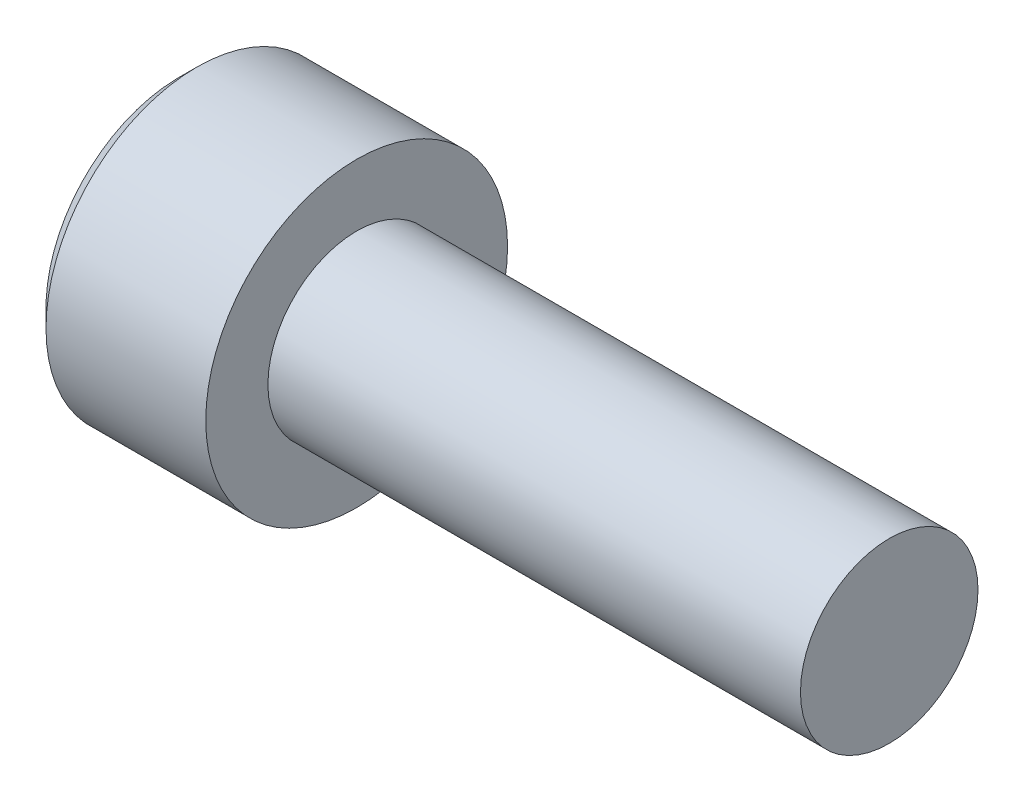
ISO-10303-21;
HEADER;
FILE_DESCRIPTION(('STEP AP214'),'2;1');
FILE_NAME('part.step','',(''),(''),'','','');
FILE_SCHEMA(('AUTOMOTIVE_DESIGN { 1 0 10303 214 1 1 1 1 }'));
ENDSEC;
DATA;
#1=APPLICATION_CONTEXT('core data for automotive mechanical design processes');
#2=APPLICATION_PROTOCOL_DEFINITION('international standard','automotive_design',2000,#1);
#3=PRODUCT_CONTEXT('',#1,'mechanical');
#4=PRODUCT('Part','Part','',(#3));
#5=PRODUCT_RELATED_PRODUCT_CATEGORY('part','',(#4));
#6=PRODUCT_DEFINITION_FORMATION('','',#4);
#7=PRODUCT_DEFINITION_CONTEXT('part definition',#1,'design');
#8=PRODUCT_DEFINITION('design','',#6,#7);
#9=PRODUCT_DEFINITION_SHAPE('','',#8);
#10=(LENGTH_UNIT() NAMED_UNIT(*) SI_UNIT(.MILLI.,.METRE.));
#11=(NAMED_UNIT(*) PLANE_ANGLE_UNIT() SI_UNIT($,.RADIAN.));
#12=(NAMED_UNIT(*) SI_UNIT($,.STERADIAN.) SOLID_ANGLE_UNIT());
#13=UNCERTAINTY_MEASURE_WITH_UNIT(LENGTH_MEASURE(1.E-05),#10,'distance_accuracy_value','');
#14=(GEOMETRIC_REPRESENTATION_CONTEXT(3) GLOBAL_UNCERTAINTY_ASSIGNED_CONTEXT((#13)) GLOBAL_UNIT_ASSIGNED_CONTEXT((#10,
#11,#12)) REPRESENTATION_CONTEXT('',''));
#15=CARTESIAN_POINT('',(0.,0.,0.));
#16=DIRECTION('',(0.,0.,1.));
#17=DIRECTION('',(1.,0.,0.));
#18=AXIS2_PLACEMENT_3D('',#15,#16,#17);
#19=CARTESIAN_POINT('',(-2.5,0.,0.));
#20=DIRECTION('',(-1.,0.,0.));
#21=DIRECTION('',(0.,0.,1.));
#22=AXIS2_PLACEMENT_3D('',#19,#20,#21);
#23=PLANE('',#22);
#24=CARTESIAN_POINT('',(-2.49999999999982,0.,0.));
#25=DIRECTION('',(-1.,0.,0.));
#26=DIRECTION('',(0.,-1.,0.));
#27=AXIS2_PLACEMENT_3D('',#24,#25,#26);
#28=CIRCLE('',#27,2.);
#29=CARTESIAN_POINT('',(-2.49999999999991,1.73205080756888,1.));
#30=VERTEX_POINT('',#29);
#31=CARTESIAN_POINT('',(-2.49999999999991,0.,2.));
#32=VERTEX_POINT('',#31);
#33=EDGE_CURVE('E20',#30,#32,#28,.F.);
#34=ORIENTED_EDGE('',*,*,#33,.T.);
#35=DIRECTION('',(0.,1.,0.));
#36=VECTOR('',#35,1.);
#37=CARTESIAN_POINT('',(-2.5,0.,2.));
#38=LINE('',#37,#36);
#39=CARTESIAN_POINT('',(-2.5,1.15470053837925,2.));
#40=VERTEX_POINT('',#39);
#41=EDGE_CURVE('E85',#32,#40,#38,.T.);
#42=ORIENTED_EDGE('',*,*,#41,.T.);
#43=DIRECTION('',(0.,0.5,-0.866025403784439));
#44=VECTOR('',#43,1.);
#45=CARTESIAN_POINT('',(-2.5,1.15470053837925,2.));
#46=LINE('',#45,#44);
#47=EDGE_CURVE('E105',#40,#30,#46,.T.);
#48=ORIENTED_EDGE('',*,*,#47,.T.);
#49=EDGE_LOOP('',(#34,#42,#48));
#50=FACE_BOUND('',#49,.T.);
#51=ADVANCED_FACE('F17',(#50),#23,.T.);
#52=CARTESIAN_POINT('',(-2.5,0.,0.));
#53=DIRECTION('',(-1.,0.,0.));
#54=DIRECTION('',(0.,0.,1.));
#55=AXIS2_PLACEMENT_3D('',#52,#53,#54);
#56=PLANE('',#55);
#57=CARTESIAN_POINT('',(-2.49999999999982,0.,0.));
#58=DIRECTION('',(-1.,0.,0.));
#59=DIRECTION('',(0.,-1.,0.));
#60=AXIS2_PLACEMENT_3D('',#57,#58,#59);
#61=CIRCLE('',#60,2.);
#62=CARTESIAN_POINT('',(-2.49999999999991,-1.73205080756888,1.));
#63=VERTEX_POINT('',#62);
#64=EDGE_CURVE('E115',#32,#63,#61,.F.);
#65=ORIENTED_EDGE('',*,*,#64,.T.);
#66=DIRECTION('',(0.,0.499999999999999,0.866025403784439));
#67=VECTOR('',#66,1.);
#68=CARTESIAN_POINT('',(-2.5,-1.73205080756888,1.));
#69=LINE('',#68,#67);
#70=CARTESIAN_POINT('',(-2.5,-1.15470053837925,2.));
#71=VERTEX_POINT('',#70);
#72=EDGE_CURVE('E123',#63,#71,#69,.T.);
#73=ORIENTED_EDGE('',*,*,#72,.T.);
#74=DIRECTION('',(0.,1.,0.));
#75=VECTOR('',#74,1.);
#76=CARTESIAN_POINT('',(-2.5,0.,2.));
#77=LINE('',#76,#75);
#78=EDGE_CURVE('E135',#71,#32,#77,.T.);
#79=ORIENTED_EDGE('',*,*,#78,.T.);
#80=EDGE_LOOP('',(#65,#73,#79));
#81=FACE_BOUND('',#80,.T.);
#82=ADVANCED_FACE('F411',(#81),#56,.T.);
#83=CARTESIAN_POINT('',(-2.5,0.,0.));
#84=DIRECTION('',(-1.,0.,0.));
#85=DIRECTION('',(0.,0.,1.));
#86=AXIS2_PLACEMENT_3D('',#83,#84,#85);
#87=PLANE('',#86);
#88=CARTESIAN_POINT('',(-2.49999999999982,0.,0.));
#89=DIRECTION('',(-1.,0.,0.));
#90=DIRECTION('',(0.,-1.,0.));
#91=AXIS2_PLACEMENT_3D('',#88,#89,#90);
#92=CIRCLE('',#91,2.);
#93=CARTESIAN_POINT('',(-2.49999999999991,0.,-2.));
#94=VERTEX_POINT('',#93);
#95=CARTESIAN_POINT('',(-2.49999999999991,1.73205080756888,-1.));
#96=VERTEX_POINT('',#95);
#97=EDGE_CURVE('E101',#94,#96,#92,.F.);
#98=ORIENTED_EDGE('',*,*,#97,.T.);
#99=DIRECTION('',(0.,-0.5,-0.866025403784439));
#100=VECTOR('',#99,1.);
#101=CARTESIAN_POINT('',(-2.5,1.73205080756888,-1.));
#102=LINE('',#101,#100);
#103=CARTESIAN_POINT('',(-2.5,1.15470053837925,-2.));
#104=VERTEX_POINT('',#103);
#105=EDGE_CURVE('E116',#96,#104,#102,.T.);
#106=ORIENTED_EDGE('',*,*,#105,.T.);
#107=DIRECTION('',(0.,1.,0.));
#108=VECTOR('',#107,1.);
#109=CARTESIAN_POINT('',(-2.5,0.,-2.));
#110=LINE('',#109,#108);
#111=EDGE_CURVE('E119',#104,#94,#110,.F.);
#112=ORIENTED_EDGE('',*,*,#111,.T.);
#113=EDGE_LOOP('',(#98,#106,#112));
#114=FACE_BOUND('',#113,.T.);
#115=ADVANCED_FACE('F402',(#114),#87,.T.);
#116=CARTESIAN_POINT('',(-2.49999999999995,0.,0.));
#117=DIRECTION('',(-1.,0.,0.));
#118=DIRECTION('',(0.,-1.,0.));
#119=AXIS2_PLACEMENT_3D('',#116,#117,#118);
#120=CONICAL_SURFACE('',#119,2.00000000000022,1.04719755119663);
#121=CARTESIAN_POINT('',(-1.3452994616206,2.22044604925031E-13,0.));
#122=VERTEX_POINT('',#121);
#123=VERTEX_LOOP('',#122);
#124=FACE_BOUND('',#123,.T.);
#125=ORIENTED_EDGE('',*,*,#33,.F.);
#126=CARTESIAN_POINT('',(-2.49999999999982,0.,0.));
#127=DIRECTION('',(-1.,0.,0.));
#128=DIRECTION('',(0.,-1.,0.));
#129=AXIS2_PLACEMENT_3D('',#126,#127,#128);
#130=CIRCLE('',#129,2.);
#131=EDGE_CURVE('E91',#96,#30,#130,.F.);
#132=ORIENTED_EDGE('',*,*,#131,.F.);
#133=ORIENTED_EDGE('',*,*,#97,.F.);
#134=CARTESIAN_POINT('',(-2.49999999999982,0.,0.));
#135=DIRECTION('',(-1.,0.,0.));
#136=DIRECTION('',(0.,-1.,0.));
#137=AXIS2_PLACEMENT_3D('',#134,#135,#136);
#138=CIRCLE('',#137,2.);
#139=CARTESIAN_POINT('',(-2.49999999999991,-1.73205080756888,-0.999999999999999));
#140=VERTEX_POINT('',#139);
#141=EDGE_CURVE('E171',#140,#94,#138,.F.);
#142=ORIENTED_EDGE('',*,*,#141,.F.);
#143=CARTESIAN_POINT('',(-2.49999999999982,0.,0.));
#144=DIRECTION('',(-1.,0.,0.));
#145=DIRECTION('',(0.,-1.,0.));
#146=AXIS2_PLACEMENT_3D('',#143,#144,#145);
#147=CIRCLE('',#146,2.);
#148=EDGE_CURVE('E117',#63,#140,#147,.F.);
#149=ORIENTED_EDGE('',*,*,#148,.F.);
#150=ORIENTED_EDGE('',*,*,#64,.F.);
#151=EDGE_LOOP('',(#125,#132,#133,#142,#149,#150));
#152=FACE_BOUND('',#151,.T.);
#153=ADVANCED_FACE('F113',(#124,#152),#120,.F.);
#154=CARTESIAN_POINT('',(-2.5,0.,0.));
#155=DIRECTION('',(-1.,0.,0.));
#156=DIRECTION('',(0.,0.,1.));
#157=AXIS2_PLACEMENT_3D('',#154,#155,#156);
#158=PLANE('',#157);
#159=ORIENTED_EDGE('',*,*,#141,.T.);
#160=DIRECTION('',(0.,1.,0.));
#161=VECTOR('',#160,1.);
#162=CARTESIAN_POINT('',(-2.5,1.15470053837925,-2.));
#163=LINE('',#162,#161);
#164=CARTESIAN_POINT('',(-2.5,-1.15470053837925,-2.));
#165=VERTEX_POINT('',#164);
#166=EDGE_CURVE('E173',#94,#165,#163,.F.);
#167=ORIENTED_EDGE('',*,*,#166,.T.);
#168=DIRECTION('',(0.,-0.499999999999999,0.866025403784439));
#169=VECTOR('',#168,1.);
#170=CARTESIAN_POINT('',(-2.5,-1.15470053837925,-2.));
#171=LINE('',#170,#169);
#172=EDGE_CURVE('E100',#165,#140,#171,.T.);
#173=ORIENTED_EDGE('',*,*,#172,.T.);
#174=EDGE_LOOP('',(#159,#167,#173));
#175=FACE_BOUND('',#174,.T.);
#176=ADVANCED_FACE('F196',(#175),#158,.T.);
#177=CARTESIAN_POINT('',(-2.5,0.,0.));
#178=DIRECTION('',(-1.,0.,0.));
#179=DIRECTION('',(0.,0.,1.));
#180=AXIS2_PLACEMENT_3D('',#177,#178,#179);
#181=PLANE('',#180);
#182=ORIENTED_EDGE('',*,*,#148,.T.);
#183=DIRECTION('',(0.,0.5,-0.866025403784439));
#184=VECTOR('',#183,1.);
#185=CARTESIAN_POINT('',(-2.5,-1.15470053837925,-2.));
#186=LINE('',#185,#184);
#187=CARTESIAN_POINT('',(-2.5,-2.3094010767585,0.));
#188=VERTEX_POINT('',#187);
#189=EDGE_CURVE('E180',#140,#188,#186,.F.);
#190=ORIENTED_EDGE('',*,*,#189,.T.);
#191=DIRECTION('',(0.,-0.5,-0.866025403784439));
#192=VECTOR('',#191,1.);
#193=CARTESIAN_POINT('',(-2.5,-2.3094010767585,0.));
#194=LINE('',#193,#192);
#195=EDGE_CURVE('E155',#188,#63,#194,.F.);
#196=ORIENTED_EDGE('',*,*,#195,.T.);
#197=EDGE_LOOP('',(#182,#190,#196));
#198=FACE_BOUND('',#197,.T.);
#199=ADVANCED_FACE('F179',(#198),#181,.T.);
#200=CARTESIAN_POINT('',(-2.5,0.,0.));
#201=DIRECTION('',(-1.,0.,0.));
#202=DIRECTION('',(0.,0.,1.));
#203=AXIS2_PLACEMENT_3D('',#200,#201,#202);
#204=PLANE('',#203);
#205=ORIENTED_EDGE('',*,*,#131,.T.);
#206=DIRECTION('',(0.,-0.5,0.866025403784439));
#207=VECTOR('',#206,1.);
#208=CARTESIAN_POINT('',(-2.5,1.15470053837925,2.));
#209=LINE('',#208,#207);
#210=CARTESIAN_POINT('',(-2.5,2.3094010767585,0.));
#211=VERTEX_POINT('',#210);
#212=EDGE_CURVE('E94',#30,#211,#209,.F.);
#213=ORIENTED_EDGE('',*,*,#212,.T.);
#214=DIRECTION('',(0.,0.5,0.866025403784439));
#215=VECTOR('',#214,1.);
#216=CARTESIAN_POINT('',(-2.5,2.3094010767585,0.));
#217=LINE('',#216,#215);
#218=EDGE_CURVE('E96',#211,#96,#217,.F.);
#219=ORIENTED_EDGE('',*,*,#218,.T.);
#220=EDGE_LOOP('',(#205,#213,#219));
#221=FACE_BOUND('',#220,.T.);
#222=ADVANCED_FACE('F93',(#221),#204,.T.);
#223=CARTESIAN_POINT('',(-2.5,1.15470053837925,-2.));
#224=DIRECTION('',(0.,0.,-1.));
#225=DIRECTION('',(0.,1.,0.));
#226=AXIS2_PLACEMENT_3D('',#223,#224,#225);
#227=PLANE('',#226);
#228=DIRECTION('',(1.,0.,0.));
#229=VECTOR('',#228,1.);
#230=CARTESIAN_POINT('',(-2.5,-1.15470053837925,-2.));
#231=LINE('',#230,#229);
#232=CARTESIAN_POINT('',(-5.,-1.15470053837925,-2.));
#233=VERTEX_POINT('',#232);
#234=EDGE_CURVE('E192',#233,#165,#231,.T.);
#235=ORIENTED_EDGE('',*,*,#234,.T.);
#236=ORIENTED_EDGE('',*,*,#166,.F.);
#237=ORIENTED_EDGE('',*,*,#111,.F.);
#238=DIRECTION('',(1.,0.,0.));
#239=VECTOR('',#238,1.);
#240=CARTESIAN_POINT('',(-2.5,1.15470053837925,-2.));
#241=LINE('',#240,#239);
#242=CARTESIAN_POINT('',(-5.,1.15470053837925,-2.));
#243=VERTEX_POINT('',#242);
#244=EDGE_CURVE('E146',#104,#243,#241,.F.);
#245=ORIENTED_EDGE('',*,*,#244,.T.);
#246=DIRECTION('',(0.,1.,0.));
#247=VECTOR('',#246,1.);
#248=CARTESIAN_POINT('',(-5.,0.,-2.));
#249=LINE('',#248,#247);
#250=EDGE_CURVE('E149',#243,#233,#249,.F.);
#251=ORIENTED_EDGE('',*,*,#250,.T.);
#252=EDGE_LOOP('',(#235,#236,#237,#245,#251));
#253=FACE_BOUND('',#252,.T.);
#254=ADVANCED_FACE('F209',(#253),#227,.F.);
#255=CARTESIAN_POINT('',(-2.5,-1.15470053837925,-2.));
#256=DIRECTION('',(0.,-0.866025403784439,-0.5));
#257=DIRECTION('',(0.,0.5,-0.866025403784439));
#258=AXIS2_PLACEMENT_3D('',#255,#256,#257);
#259=PLANE('',#258);
#260=DIRECTION('',(1.,0.,0.));
#261=VECTOR('',#260,1.);
#262=CARTESIAN_POINT('',(-2.5,-2.3094010767585,0.));
#263=LINE('',#262,#261);
#264=CARTESIAN_POINT('',(-5.,-2.3094010767585,0.));
#265=VERTEX_POINT('',#264);
#266=EDGE_CURVE('E191',#265,#188,#263,.T.);
#267=ORIENTED_EDGE('',*,*,#266,.T.);
#268=ORIENTED_EDGE('',*,*,#189,.F.);
#269=ORIENTED_EDGE('',*,*,#172,.F.);
#270=ORIENTED_EDGE('',*,*,#234,.F.);
#271=DIRECTION('',(0.,-0.5,0.866025403784439));
#272=VECTOR('',#271,1.);
#273=CARTESIAN_POINT('',(-5.,-1.15470053837925,-2.));
#274=LINE('',#273,#272);
#275=EDGE_CURVE('E212',#233,#265,#274,.T.);
#276=ORIENTED_EDGE('',*,*,#275,.T.);
#277=EDGE_LOOP('',(#267,#268,#269,#270,#276));
#278=FACE_BOUND('',#277,.T.);
#279=ADVANCED_FACE('F186',(#278),#259,.F.);
#280=CARTESIAN_POINT('',(-2.5,-2.3094010767585,0.));
#281=DIRECTION('',(0.,-0.866025403784439,0.5));
#282=DIRECTION('',(0.,-0.5,-0.866025403784439));
#283=AXIS2_PLACEMENT_3D('',#280,#281,#282);
#284=PLANE('',#283);
#285=DIRECTION('',(1.,0.,0.));
#286=VECTOR('',#285,1.);
#287=CARTESIAN_POINT('',(-2.5,-1.15470053837925,2.));
#288=LINE('',#287,#286);
#289=CARTESIAN_POINT('',(-5.,-1.15470053837925,2.));
#290=VERTEX_POINT('',#289);
#291=EDGE_CURVE('E152',#290,#71,#288,.T.);
#292=ORIENTED_EDGE('',*,*,#291,.T.);
#293=ORIENTED_EDGE('',*,*,#72,.F.);
#294=ORIENTED_EDGE('',*,*,#195,.F.);
#295=ORIENTED_EDGE('',*,*,#266,.F.);
#296=DIRECTION('',(0.,0.5,0.866025403784438));
#297=VECTOR('',#296,1.);
#298=CARTESIAN_POINT('',(-5.,-2.3094010767585,0.));
#299=LINE('',#298,#297);
#300=EDGE_CURVE('E220',#265,#290,#299,.T.);
#301=ORIENTED_EDGE('',*,*,#300,.T.);
#302=EDGE_LOOP('',(#292,#293,#294,#295,#301));
#303=FACE_BOUND('',#302,.T.);
#304=ADVANCED_FACE('F351',(#303),#284,.F.);
#305=CARTESIAN_POINT('',(-2.5,-1.15470053837925,2.));
#306=DIRECTION('',(0.,0.,1.));
#307=DIRECTION('',(1.,0.,0.));
#308=AXIS2_PLACEMENT_3D('',#305,#306,#307);
#309=PLANE('',#308);
#310=DIRECTION('',(1.,0.,0.));
#311=VECTOR('',#310,1.);
#312=CARTESIAN_POINT('',(-2.5,1.15470053837925,2.));
#313=LINE('',#312,#311);
#314=CARTESIAN_POINT('',(-5.,1.15470053837925,2.));
#315=VERTEX_POINT('',#314);
#316=EDGE_CURVE('E107',#315,#40,#313,.T.);
#317=ORIENTED_EDGE('',*,*,#316,.T.);
#318=ORIENTED_EDGE('',*,*,#41,.F.);
#319=ORIENTED_EDGE('',*,*,#78,.F.);
#320=ORIENTED_EDGE('',*,*,#291,.F.);
#321=DIRECTION('',(0.,1.,0.));
#322=VECTOR('',#321,1.);
#323=CARTESIAN_POINT('',(-5.,0.,2.));
#324=LINE('',#323,#322);
#325=EDGE_CURVE('E222',#290,#315,#324,.T.);
#326=ORIENTED_EDGE('',*,*,#325,.T.);
#327=EDGE_LOOP('',(#317,#318,#319,#320,#326));
#328=FACE_BOUND('',#327,.T.);
#329=ADVANCED_FACE('F343',(#328),#309,.F.);
#330=CARTESIAN_POINT('',(-2.5,1.15470053837925,2.));
#331=DIRECTION('',(0.,0.866025403784439,0.5));
#332=DIRECTION('',(0.,-0.5,0.866025403784439));
#333=AXIS2_PLACEMENT_3D('',#330,#331,#332);
#334=PLANE('',#333);
#335=DIRECTION('',(1.,0.,0.));
#336=VECTOR('',#335,1.);
#337=CARTESIAN_POINT('',(-2.5,2.3094010767585,0.));
#338=LINE('',#337,#336);
#339=CARTESIAN_POINT('',(-5.,2.3094010767585,0.));
#340=VERTEX_POINT('',#339);
#341=EDGE_CURVE('E106',#340,#211,#338,.T.);
#342=ORIENTED_EDGE('',*,*,#341,.T.);
#343=ORIENTED_EDGE('',*,*,#212,.F.);
#344=ORIENTED_EDGE('',*,*,#47,.F.);
#345=ORIENTED_EDGE('',*,*,#316,.F.);
#346=DIRECTION('',(0.,0.5,-0.866025403784439));
#347=VECTOR('',#346,1.);
#348=CARTESIAN_POINT('',(-5.,1.15470053837925,2.));
#349=LINE('',#348,#347);
#350=EDGE_CURVE('E35',#315,#340,#349,.T.);
#351=ORIENTED_EDGE('',*,*,#350,.T.);
#352=EDGE_LOOP('',(#342,#343,#344,#345,#351));
#353=FACE_BOUND('',#352,.T.);
#354=ADVANCED_FACE('F104',(#353),#334,.F.);
#355=CARTESIAN_POINT('',(-2.5,2.3094010767585,0.));
#356=DIRECTION('',(0.,0.866025403784439,-0.5));
#357=DIRECTION('',(0.,0.5,0.866025403784439));
#358=AXIS2_PLACEMENT_3D('',#355,#356,#357);
#359=PLANE('',#358);
#360=ORIENTED_EDGE('',*,*,#244,.F.);
#361=ORIENTED_EDGE('',*,*,#105,.F.);
#362=ORIENTED_EDGE('',*,*,#218,.F.);
#363=ORIENTED_EDGE('',*,*,#341,.F.);
#364=DIRECTION('',(0.,-0.5,-0.866025403784439));
#365=VECTOR('',#364,1.);
#366=CARTESIAN_POINT('',(-5.,2.3094010767585,0.));
#367=LINE('',#366,#365);
#368=EDGE_CURVE('E170',#340,#243,#367,.T.);
#369=ORIENTED_EDGE('',*,*,#368,.T.);
#370=EDGE_LOOP('',(#360,#361,#362,#363,#369));
#371=FACE_BOUND('',#370,.T.);
#372=ADVANCED_FACE('F263',(#371),#359,.F.);
#373=CARTESIAN_POINT('',(-5.,0.,0.));
#374=DIRECTION('',(1.,0.,0.));
#375=DIRECTION('',(0.,1.,0.));
#376=AXIS2_PLACEMENT_3D('',#373,#374,#375);
#377=PLANE('',#376);
#378=ORIENTED_EDGE('',*,*,#350,.F.);
#379=ORIENTED_EDGE('',*,*,#325,.F.);
#380=ORIENTED_EDGE('',*,*,#300,.F.);
#381=ORIENTED_EDGE('',*,*,#275,.F.);
#382=ORIENTED_EDGE('',*,*,#250,.F.);
#383=ORIENTED_EDGE('',*,*,#368,.F.);
#384=EDGE_LOOP('',(#378,#379,#380,#381,#382,#383));
#385=FACE_BOUND('',#384,.T.);
#386=CARTESIAN_POINT('',(-4.99999999999545,0.,0.));
#387=DIRECTION('',(1.,0.,0.));
#388=DIRECTION('',(0.,0.,-1.));
#389=AXIS2_PLACEMENT_3D('',#386,#387,#388);
#390=CIRCLE('',#389,3.75000000002501);
#391=CARTESIAN_POINT('',(-4.99999999999545,0.,-3.75000000002501));
#392=VERTEX_POINT('',#391);
#393=EDGE_CURVE('E167',#392,#392,#390,.T.);
#394=ORIENTED_EDGE('',*,*,#393,.F.);
#395=EDGE_LOOP('',(#394));
#396=FACE_BOUND('',#395,.T.);
#397=ADVANCED_FACE('F215',(#385,#396),#377,.F.);
#398=CARTESIAN_POINT('',(-4.50000000000728,0.,0.));
#399=DIRECTION('',(1.,0.,0.));
#400=DIRECTION('',(0.,0.,-1.));
#401=AXIS2_PLACEMENT_3D('',#398,#399,#400);
#402=CONICAL_SURFACE('',#401,4.25000000001319,0.785398163397448);
#403=CARTESIAN_POINT('',(-4.5,0.,0.));
#404=DIRECTION('',(-1.,0.,0.));
#405=DIRECTION('',(0.,-1.,0.));
#406=AXIS2_PLACEMENT_3D('',#403,#404,#405);
#407=CIRCLE('',#406,4.25);
#408=CARTESIAN_POINT('',(-4.5,-4.25,0.));
#409=VERTEX_POINT('',#408);
#410=EDGE_CURVE('E166',#409,#409,#407,.F.);
#411=ORIENTED_EDGE('',*,*,#410,.F.);
#412=EDGE_LOOP('',(#411));
#413=FACE_BOUND('',#412,.T.);
#414=ORIENTED_EDGE('',*,*,#393,.T.);
#415=EDGE_LOOP('',(#414));
#416=FACE_BOUND('',#415,.T.);
#417=ADVANCED_FACE('F257',(#413,#416),#402,.T.);
#418=CARTESIAN_POINT('',(-5.,0.,0.));
#419=DIRECTION('',(-1.,0.,0.));
#420=DIRECTION('',(0.,-1.,0.));
#421=AXIS2_PLACEMENT_3D('',#418,#419,#420);
#422=CYLINDRICAL_SURFACE('',#421,4.25);
#423=ORIENTED_EDGE('',*,*,#410,.T.);
#424=EDGE_LOOP('',(#423));
#425=FACE_BOUND('',#424,.T.);
#426=CARTESIAN_POINT('',(0.,0.,0.));
#427=DIRECTION('',(-1.,0.,0.));
#428=DIRECTION('',(0.,-1.,0.));
#429=AXIS2_PLACEMENT_3D('',#426,#427,#428);
#430=CIRCLE('',#429,4.25);
#431=CARTESIAN_POINT('',(0.,-4.25,0.));
#432=VERTEX_POINT('',#431);
#433=EDGE_CURVE('E163',#432,#432,#430,.T.);
#434=ORIENTED_EDGE('',*,*,#433,.T.);
#435=EDGE_LOOP('',(#434));
#436=FACE_BOUND('',#435,.T.);
#437=ADVANCED_FACE('F254',(#425,#436),#422,.T.);
#438=CARTESIAN_POINT('',(15.,2.5,0.));
#439=DIRECTION('',(-1.,0.,0.));
#440=DIRECTION('',(0.,-1.,0.));
#441=AXIS2_PLACEMENT_3D('',#438,#439,#440);
#442=PLANE('',#441);
#443=CARTESIAN_POINT('',(15.,0.,0.));
#444=DIRECTION('',(-1.,0.,0.));
#445=DIRECTION('',(0.,-1.,0.));
#446=AXIS2_PLACEMENT_3D('',#443,#444,#445);
#447=CIRCLE('',#446,2.5);
#448=CARTESIAN_POINT('',(15.,-2.5,0.));
#449=VERTEX_POINT('',#448);
#450=EDGE_CURVE('E26',#449,#449,#447,.T.);
#451=ORIENTED_EDGE('',*,*,#450,.F.);
#452=EDGE_LOOP('',(#451));
#453=FACE_BOUND('',#452,.T.);
#454=ADVANCED_FACE('F279',(#453),#442,.F.);
#455=CARTESIAN_POINT('',(0.,2.5,0.));
#456=DIRECTION('',(-1.,0.,0.));
#457=DIRECTION('',(0.,-1.,0.));
#458=AXIS2_PLACEMENT_3D('',#455,#456,#457);
#459=PLANE('',#458);
#460=CARTESIAN_POINT('',(0.,0.,0.));
#461=DIRECTION('',(-1.,0.,0.));
#462=DIRECTION('',(0.,-1.,0.));
#463=AXIS2_PLACEMENT_3D('',#460,#461,#462);
#464=CIRCLE('',#463,2.5);
#465=CARTESIAN_POINT('',(0.,-2.5,0.));
#466=VERTEX_POINT('',#465);
#467=EDGE_CURVE('E10',#466,#466,#464,.F.);
#468=ORIENTED_EDGE('',*,*,#467,.F.);
#469=EDGE_LOOP('',(#468));
#470=FACE_BOUND('',#469,.T.);
#471=ORIENTED_EDGE('',*,*,#433,.F.);
#472=EDGE_LOOP('',(#471));
#473=FACE_BOUND('',#472,.T.);
#474=ADVANCED_FACE('F273',(#470,#473),#459,.F.);
#475=CARTESIAN_POINT('',(-5.,0.,0.));
#476=DIRECTION('',(-1.,0.,0.));
#477=DIRECTION('',(0.,-1.,0.));
#478=AXIS2_PLACEMENT_3D('',#475,#476,#477);
#479=CYLINDRICAL_SURFACE('',#478,2.5);
#480=ORIENTED_EDGE('',*,*,#467,.T.);
#481=EDGE_LOOP('',(#480));
#482=FACE_BOUND('',#481,.T.);
#483=ORIENTED_EDGE('',*,*,#450,.T.);
#484=EDGE_LOOP('',(#483));
#485=FACE_BOUND('',#484,.T.);
#486=ADVANCED_FACE('F271',(#482,#485),#479,.T.);
#487=CLOSED_SHELL('',(#51,#82,#115,#153,#176,#199,#222,#254,#279,#304,#329,#354,#372,#397,#417,
#437,#454,#474,#486));
#488=MANIFOLD_SOLID_BREP('B1',#487);
#489=ADVANCED_BREP_SHAPE_REPRESENTATION('',(#18,#488),#14);
#490=SHAPE_DEFINITION_REPRESENTATION(#9,#489);
ENDSEC;
END-ISO-10303-21;
